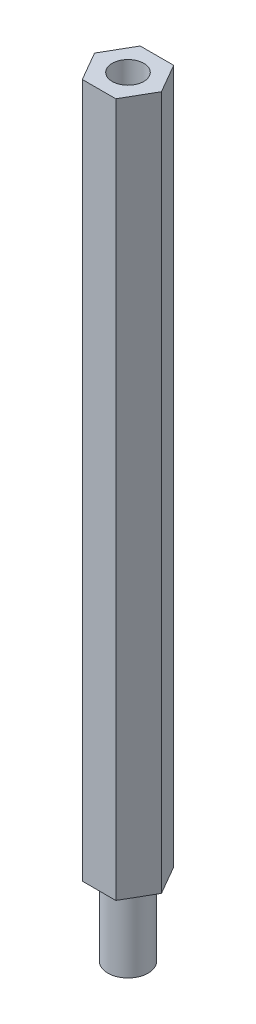
ISO-10303-21;
HEADER;
FILE_DESCRIPTION(('STEP AP214'),'2;1');
FILE_NAME('part.step','',(''),(''),'','','');
FILE_SCHEMA(('AUTOMOTIVE_DESIGN { 1 0 10303 214 1 1 1 1 }'));
ENDSEC;
DATA;
#1=APPLICATION_CONTEXT('core data for automotive mechanical design processes');
#2=APPLICATION_PROTOCOL_DEFINITION('international standard','automotive_design',2000,#1);
#3=PRODUCT_CONTEXT('',#1,'mechanical');
#4=PRODUCT('Part','Part','',(#3));
#5=PRODUCT_RELATED_PRODUCT_CATEGORY('part','',(#4));
#6=PRODUCT_DEFINITION_FORMATION('','',#4);
#7=PRODUCT_DEFINITION_CONTEXT('part definition',#1,'design');
#8=PRODUCT_DEFINITION('design','',#6,#7);
#9=PRODUCT_DEFINITION_SHAPE('','',#8);
#10=(LENGTH_UNIT() NAMED_UNIT(*) SI_UNIT(.MILLI.,.METRE.));
#11=(NAMED_UNIT(*) PLANE_ANGLE_UNIT() SI_UNIT($,.RADIAN.));
#12=(NAMED_UNIT(*) SI_UNIT($,.STERADIAN.) SOLID_ANGLE_UNIT());
#13=UNCERTAINTY_MEASURE_WITH_UNIT(LENGTH_MEASURE(1.E-05),#10,'distance_accuracy_value','');
#14=(GEOMETRIC_REPRESENTATION_CONTEXT(3) GLOBAL_UNCERTAINTY_ASSIGNED_CONTEXT((#13)) GLOBAL_UNIT_ASSIGNED_CONTEXT((#10,
#11,#12)) REPRESENTATION_CONTEXT('',''));
#15=CARTESIAN_POINT('',(0.,0.,0.));
#16=DIRECTION('',(0.,0.,1.));
#17=DIRECTION('',(1.,0.,0.));
#18=AXIS2_PLACEMENT_3D('',#15,#16,#17);
#19=CARTESIAN_POINT('',(-1.325,55.,2.29496732002876));
#20=DIRECTION('',(0.,0.,-1.));
#21=DIRECTION('',(-1.,0.,0.));
#22=AXIS2_PLACEMENT_3D('',#19,#20,#21);
#23=PLANE('',#22);
#24=DIRECTION('',(1.,0.,0.));
#25=VECTOR('',#24,1.);
#26=CARTESIAN_POINT('',(-1.325,0.,2.29496732002876));
#27=LINE('',#26,#25);
#28=CARTESIAN_POINT('',(-1.325,0.,2.29496732002876));
#29=VERTEX_POINT('',#28);
#30=CARTESIAN_POINT('',(1.325,0.,2.29496732002876));
#31=VERTEX_POINT('',#30);
#32=EDGE_CURVE('E122',#29,#31,#27,.T.);
#33=ORIENTED_EDGE('',*,*,#32,.T.);
#34=DIRECTION('',(0.,-1.,0.));
#35=VECTOR('',#34,1.);
#36=CARTESIAN_POINT('',(1.325,55.,2.29496732002876));
#37=LINE('',#36,#35);
#38=CARTESIAN_POINT('',(1.325,55.,2.29496732002876));
#39=VERTEX_POINT('',#38);
#40=EDGE_CURVE('E45',#39,#31,#37,.T.);
#41=ORIENTED_EDGE('',*,*,#40,.F.);
#42=DIRECTION('',(1.,0.,0.));
#43=VECTOR('',#42,1.);
#44=CARTESIAN_POINT('',(-1.325,55.,2.29496732002876));
#45=LINE('',#44,#43);
#46=CARTESIAN_POINT('',(-1.325,55.,2.29496732002876));
#47=VERTEX_POINT('',#46);
#48=EDGE_CURVE('E133',#47,#39,#45,.T.);
#49=ORIENTED_EDGE('',*,*,#48,.F.);
#50=DIRECTION('',(0.,-1.,0.));
#51=VECTOR('',#50,1.);
#52=CARTESIAN_POINT('',(-1.325,55.,2.29496732002876));
#53=LINE('',#52,#51);
#54=EDGE_CURVE('E118',#47,#29,#53,.T.);
#55=ORIENTED_EDGE('',*,*,#54,.T.);
#56=EDGE_LOOP('',(#33,#41,#49,#55));
#57=FACE_BOUND('',#56,.T.);
#58=ADVANCED_FACE('F37',(#57),#23,.F.);
#59=CARTESIAN_POINT('',(1.325,55.,2.29496732002876));
#60=DIRECTION('',(-0.866025403784439,0.,-0.5));
#61=DIRECTION('',(-0.5,0.,0.866025403784439));
#62=AXIS2_PLACEMENT_3D('',#59,#60,#61);
#63=PLANE('',#62);
#64=DIRECTION('',(0.5,0.,-0.866025403784439));
#65=VECTOR('',#64,1.);
#66=CARTESIAN_POINT('',(1.325,0.,2.29496732002876));
#67=LINE('',#66,#65);
#68=CARTESIAN_POINT('',(2.65,0.,0.));
#69=VERTEX_POINT('',#68);
#70=EDGE_CURVE('E125',#31,#69,#67,.T.);
#71=ORIENTED_EDGE('',*,*,#70,.T.);
#72=DIRECTION('',(0.,-1.,0.));
#73=VECTOR('',#72,1.);
#74=CARTESIAN_POINT('',(2.65,55.,0.));
#75=LINE('',#74,#73);
#76=CARTESIAN_POINT('',(2.65,55.,0.));
#77=VERTEX_POINT('',#76);
#78=EDGE_CURVE('E137',#77,#69,#75,.T.);
#79=ORIENTED_EDGE('',*,*,#78,.F.);
#80=DIRECTION('',(0.5,0.,-0.866025403784439));
#81=VECTOR('',#80,1.);
#82=CARTESIAN_POINT('',(1.325,55.,2.29496732002876));
#83=LINE('',#82,#81);
#84=EDGE_CURVE('E91',#39,#77,#83,.T.);
#85=ORIENTED_EDGE('',*,*,#84,.F.);
#86=ORIENTED_EDGE('',*,*,#40,.T.);
#87=EDGE_LOOP('',(#71,#79,#85,#86));
#88=FACE_BOUND('',#87,.T.);
#89=ADVANCED_FACE('F140',(#88),#63,.F.);
#90=CARTESIAN_POINT('',(2.65,55.,0.));
#91=DIRECTION('',(-0.866025403784439,0.,0.5));
#92=DIRECTION('',(0.5,0.,0.866025403784439));
#93=AXIS2_PLACEMENT_3D('',#90,#91,#92);
#94=PLANE('',#93);
#95=DIRECTION('',(-0.5,0.,-0.866025403784439));
#96=VECTOR('',#95,1.);
#97=CARTESIAN_POINT('',(2.65,0.,0.));
#98=LINE('',#97,#96);
#99=CARTESIAN_POINT('',(1.325,0.,-2.29496732002876));
#100=VERTEX_POINT('',#99);
#101=EDGE_CURVE('E128',#69,#100,#98,.T.);
#102=ORIENTED_EDGE('',*,*,#101,.T.);
#103=DIRECTION('',(0.,-1.,0.));
#104=VECTOR('',#103,1.);
#105=CARTESIAN_POINT('',(1.325,55.,-2.29496732002876));
#106=LINE('',#105,#104);
#107=CARTESIAN_POINT('',(1.325,55.,-2.29496732002876));
#108=VERTEX_POINT('',#107);
#109=EDGE_CURVE('E113',#108,#100,#106,.T.);
#110=ORIENTED_EDGE('',*,*,#109,.F.);
#111=DIRECTION('',(-0.5,0.,-0.866025403784439));
#112=VECTOR('',#111,1.);
#113=CARTESIAN_POINT('',(2.65,55.,0.));
#114=LINE('',#113,#112);
#115=EDGE_CURVE('E104',#77,#108,#114,.T.);
#116=ORIENTED_EDGE('',*,*,#115,.F.);
#117=ORIENTED_EDGE('',*,*,#78,.T.);
#118=EDGE_LOOP('',(#102,#110,#116,#117));
#119=FACE_BOUND('',#118,.T.);
#120=ADVANCED_FACE('F148',(#119),#94,.F.);
#121=CARTESIAN_POINT('',(1.325,55.,-2.29496732002876));
#122=DIRECTION('',(0.,0.,1.));
#123=DIRECTION('',(1.,0.,0.));
#124=AXIS2_PLACEMENT_3D('',#121,#122,#123);
#125=PLANE('',#124);
#126=DIRECTION('',(-1.,0.,0.));
#127=VECTOR('',#126,1.);
#128=CARTESIAN_POINT('',(1.325,0.,-2.29496732002876));
#129=LINE('',#128,#127);
#130=CARTESIAN_POINT('',(-1.325,0.,-2.29496732002876));
#131=VERTEX_POINT('',#130);
#132=EDGE_CURVE('E112',#100,#131,#129,.T.);
#133=ORIENTED_EDGE('',*,*,#132,.T.);
#134=DIRECTION('',(0.,-1.,0.));
#135=VECTOR('',#134,1.);
#136=CARTESIAN_POINT('',(-1.325,55.,-2.29496732002876));
#137=LINE('',#136,#135);
#138=CARTESIAN_POINT('',(-1.325,55.,-2.29496732002876));
#139=VERTEX_POINT('',#138);
#140=EDGE_CURVE('E109',#139,#131,#137,.T.);
#141=ORIENTED_EDGE('',*,*,#140,.F.);
#142=DIRECTION('',(-1.,0.,0.));
#143=VECTOR('',#142,1.);
#144=CARTESIAN_POINT('',(1.325,55.,-2.29496732002876));
#145=LINE('',#144,#143);
#146=EDGE_CURVE('E98',#108,#139,#145,.T.);
#147=ORIENTED_EDGE('',*,*,#146,.F.);
#148=ORIENTED_EDGE('',*,*,#109,.T.);
#149=EDGE_LOOP('',(#133,#141,#147,#148));
#150=FACE_BOUND('',#149,.T.);
#151=ADVANCED_FACE('F110',(#150),#125,.F.);
#152=CARTESIAN_POINT('',(-1.325,55.,-2.29496732002876));
#153=DIRECTION('',(0.866025403784439,0.,0.5));
#154=DIRECTION('',(0.5,0.,-0.866025403784439));
#155=AXIS2_PLACEMENT_3D('',#152,#153,#154);
#156=PLANE('',#155);
#157=DIRECTION('',(-0.5,0.,0.866025403784439));
#158=VECTOR('',#157,1.);
#159=CARTESIAN_POINT('',(-1.325,0.,-2.29496732002876));
#160=LINE('',#159,#158);
#161=CARTESIAN_POINT('',(-2.65,0.,0.));
#162=VERTEX_POINT('',#161);
#163=EDGE_CURVE('E76',#131,#162,#160,.T.);
#164=ORIENTED_EDGE('',*,*,#163,.T.);
#165=DIRECTION('',(0.,-1.,0.));
#166=VECTOR('',#165,1.);
#167=CARTESIAN_POINT('',(-2.65,55.,0.));
#168=LINE('',#167,#166);
#169=CARTESIAN_POINT('',(-2.65,55.,0.));
#170=VERTEX_POINT('',#169);
#171=EDGE_CURVE('E114',#170,#162,#168,.T.);
#172=ORIENTED_EDGE('',*,*,#171,.F.);
#173=DIRECTION('',(-0.5,0.,0.866025403784439));
#174=VECTOR('',#173,1.);
#175=CARTESIAN_POINT('',(-1.325,55.,-2.29496732002876));
#176=LINE('',#175,#174);
#177=EDGE_CURVE('E102',#139,#170,#176,.T.);
#178=ORIENTED_EDGE('',*,*,#177,.F.);
#179=ORIENTED_EDGE('',*,*,#140,.T.);
#180=EDGE_LOOP('',(#164,#172,#178,#179));
#181=FACE_BOUND('',#180,.T.);
#182=ADVANCED_FACE('F116',(#181),#156,.F.);
#183=CARTESIAN_POINT('',(-2.65,55.,0.));
#184=DIRECTION('',(0.866025403784439,0.,-0.5));
#185=DIRECTION('',(-0.5,0.,-0.866025403784439));
#186=AXIS2_PLACEMENT_3D('',#183,#184,#185);
#187=PLANE('',#186);
#188=DIRECTION('',(0.5,0.,0.866025403784439));
#189=VECTOR('',#188,1.);
#190=CARTESIAN_POINT('',(-2.65,0.,0.));
#191=LINE('',#190,#189);
#192=EDGE_CURVE('E82',#162,#29,#191,.T.);
#193=ORIENTED_EDGE('',*,*,#192,.T.);
#194=ORIENTED_EDGE('',*,*,#54,.F.);
#195=DIRECTION('',(0.5,0.,0.866025403784439));
#196=VECTOR('',#195,1.);
#197=CARTESIAN_POINT('',(-2.65,55.,0.));
#198=LINE('',#197,#196);
#199=EDGE_CURVE('E53',#170,#47,#198,.T.);
#200=ORIENTED_EDGE('',*,*,#199,.F.);
#201=ORIENTED_EDGE('',*,*,#171,.T.);
#202=EDGE_LOOP('',(#193,#194,#200,#201));
#203=FACE_BOUND('',#202,.T.);
#204=ADVANCED_FACE('F171',(#203),#187,.F.);
#205=CARTESIAN_POINT('',(0.,55.,0.));
#206=DIRECTION('',(0.,1.,0.));
#207=DIRECTION('',(0.,0.,1.));
#208=AXIS2_PLACEMENT_3D('',#205,#206,#207);
#209=PLANE('',#208);
#210=CARTESIAN_POINT('',(0.,55.,0.));
#211=DIRECTION('',(0.,1.,0.));
#212=DIRECTION('',(0.,0.,1.));
#213=AXIS2_PLACEMENT_3D('',#210,#211,#212);
#214=CIRCLE('',#213,1.25);
#215=CARTESIAN_POINT('',(0.,55.,1.25));
#216=VERTEX_POINT('',#215);
#217=EDGE_CURVE('E155',#216,#216,#214,.T.);
#218=ORIENTED_EDGE('',*,*,#217,.F.);
#219=EDGE_LOOP('',(#218));
#220=FACE_BOUND('',#219,.T.);
#221=ORIENTED_EDGE('',*,*,#48,.T.);
#222=ORIENTED_EDGE('',*,*,#84,.T.);
#223=ORIENTED_EDGE('',*,*,#115,.T.);
#224=ORIENTED_EDGE('',*,*,#146,.T.);
#225=ORIENTED_EDGE('',*,*,#177,.T.);
#226=ORIENTED_EDGE('',*,*,#199,.T.);
#227=EDGE_LOOP('',(#221,#222,#223,#224,#225,#226));
#228=FACE_BOUND('',#227,.T.);
#229=ADVANCED_FACE('F100',(#220,#228),#209,.T.);
#230=CARTESIAN_POINT('',(0.,0.,0.));
#231=DIRECTION('',(0.,1.,0.));
#232=DIRECTION('',(0.,0.,1.));
#233=AXIS2_PLACEMENT_3D('',#230,#231,#232);
#234=PLANE('',#233);
#235=CARTESIAN_POINT('',(0.,0.,0.));
#236=DIRECTION('',(0.,1.,0.));
#237=DIRECTION('',(0.,0.,1.));
#238=AXIS2_PLACEMENT_3D('',#235,#236,#237);
#239=CIRCLE('',#238,1.6);
#240=CARTESIAN_POINT('',(0.,0.,1.6));
#241=VERTEX_POINT('',#240);
#242=EDGE_CURVE('E11',#241,#241,#239,.F.);
#243=ORIENTED_EDGE('',*,*,#242,.F.);
#244=EDGE_LOOP('',(#243));
#245=FACE_BOUND('',#244,.T.);
#246=ORIENTED_EDGE('',*,*,#32,.F.);
#247=ORIENTED_EDGE('',*,*,#192,.F.);
#248=ORIENTED_EDGE('',*,*,#163,.F.);
#249=ORIENTED_EDGE('',*,*,#132,.F.);
#250=ORIENTED_EDGE('',*,*,#101,.F.);
#251=ORIENTED_EDGE('',*,*,#70,.F.);
#252=EDGE_LOOP('',(#246,#247,#248,#249,#250,#251));
#253=FACE_BOUND('',#252,.T.);
#254=ADVANCED_FACE('F145',(#245,#253),#234,.F.);
#255=CARTESIAN_POINT('',(0.,-6.,0.));
#256=DIRECTION('',(0.,1.,0.));
#257=DIRECTION('',(0.,0.,1.));
#258=AXIS2_PLACEMENT_3D('',#255,#256,#257);
#259=CYLINDRICAL_SURFACE('',#258,1.6);
#260=CARTESIAN_POINT('',(0.,-6.,0.));
#261=DIRECTION('',(0.,-1.,0.));
#262=DIRECTION('',(0.,0.,-1.));
#263=AXIS2_PLACEMENT_3D('',#260,#261,#262);
#264=CIRCLE('',#263,1.6);
#265=CARTESIAN_POINT('',(0.,-6.,-1.6));
#266=VERTEX_POINT('',#265);
#267=EDGE_CURVE('E126',#266,#266,#264,.T.);
#268=ORIENTED_EDGE('',*,*,#267,.F.);
#269=EDGE_LOOP('',(#268));
#270=FACE_BOUND('',#269,.T.);
#271=ORIENTED_EDGE('',*,*,#242,.T.);
#272=EDGE_LOOP('',(#271));
#273=FACE_BOUND('',#272,.T.);
#274=ADVANCED_FACE('F177',(#270,#273),#259,.T.);
#275=CARTESIAN_POINT('',(0.,-6.,0.));
#276=DIRECTION('',(0.,-1.,0.));
#277=DIRECTION('',(0.,0.,-1.));
#278=AXIS2_PLACEMENT_3D('',#275,#276,#277);
#279=PLANE('',#278);
#280=ORIENTED_EDGE('',*,*,#267,.T.);
#281=EDGE_LOOP('',(#280));
#282=FACE_BOUND('',#281,.T.);
#283=ADVANCED_FACE('F166',(#282),#279,.T.);
#284=CARTESIAN_POINT('',(0.,50.,0.));
#285=DIRECTION('',(0.,1.,0.));
#286=DIRECTION('',(0.,0.,1.));
#287=AXIS2_PLACEMENT_3D('',#284,#285,#286);
#288=CYLINDRICAL_SURFACE('',#287,1.25);
#289=CARTESIAN_POINT('',(0.,50.,0.));
#290=DIRECTION('',(0.,1.,0.));
#291=DIRECTION('',(0.,0.,1.));
#292=AXIS2_PLACEMENT_3D('',#289,#290,#291);
#293=CIRCLE('',#292,1.25);
#294=CARTESIAN_POINT('',(0.,50.,1.25));
#295=VERTEX_POINT('',#294);
#296=EDGE_CURVE('E154',#295,#295,#293,.T.);
#297=ORIENTED_EDGE('',*,*,#296,.F.);
#298=EDGE_LOOP('',(#297));
#299=FACE_BOUND('',#298,.T.);
#300=ORIENTED_EDGE('',*,*,#217,.T.);
#301=EDGE_LOOP('',(#300));
#302=FACE_BOUND('',#301,.T.);
#303=ADVANCED_FACE('F163',(#299,#302),#288,.F.);
#304=CARTESIAN_POINT('',(0.,50.,0.));
#305=DIRECTION('',(0.,1.,0.));
#306=DIRECTION('',(0.,0.,1.));
#307=AXIS2_PLACEMENT_3D('',#304,#305,#306);
#308=PLANE('',#307);
#309=ORIENTED_EDGE('',*,*,#296,.T.);
#310=EDGE_LOOP('',(#309));
#311=FACE_BOUND('',#310,.T.);
#312=ADVANCED_FACE('F161',(#311),#308,.T.);
#313=CLOSED_SHELL('',(#58,#89,#120,#151,#182,#204,#229,#254,#274,#283,#303,#312));
#314=MANIFOLD_SOLID_BREP('B2',#313);
#315=ADVANCED_BREP_SHAPE_REPRESENTATION('',(#18,#314),#14);
#316=SHAPE_DEFINITION_REPRESENTATION(#9,#315);
ENDSEC;
END-ISO-10303-21;
